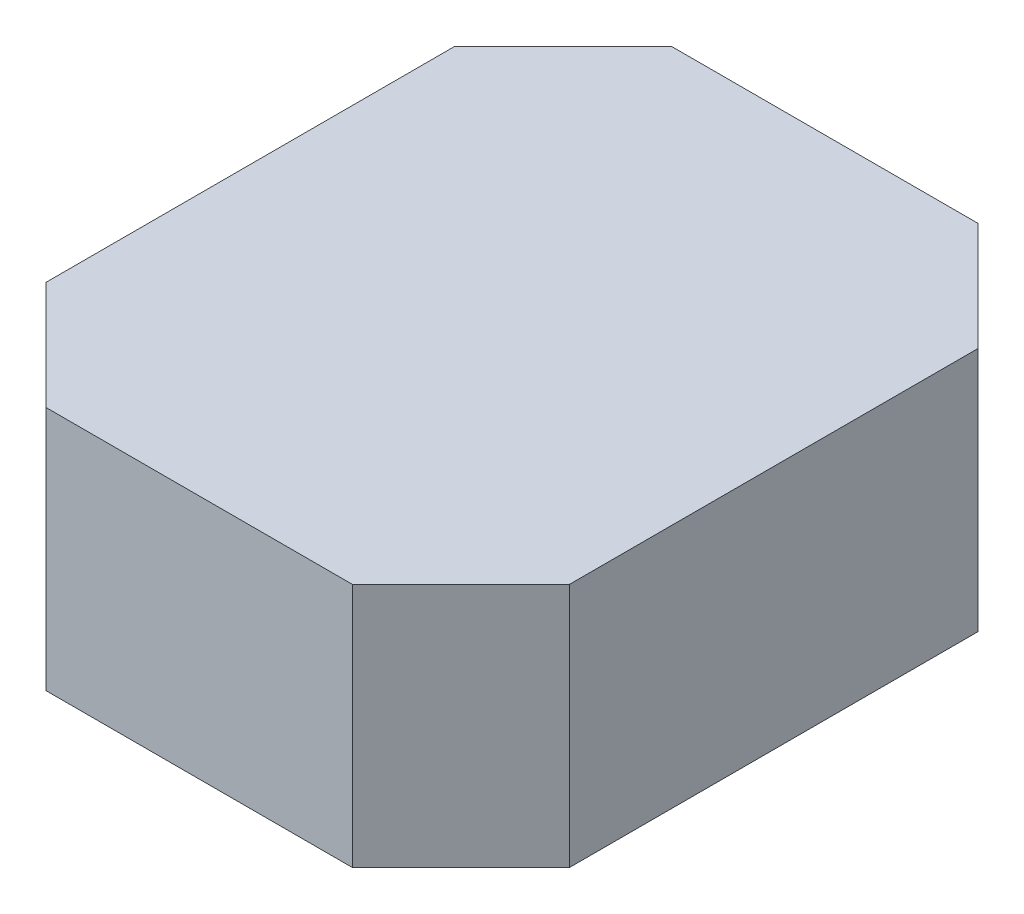
ISO-10303-21;
HEADER;
FILE_DESCRIPTION(('STEP AP214'),'2;1');
FILE_NAME('part.step','',(''),(''),'','','');
FILE_SCHEMA(('AUTOMOTIVE_DESIGN { 1 0 10303 214 1 1 1 1 }'));
ENDSEC;
DATA;
#1=APPLICATION_CONTEXT('core data for automotive mechanical design processes');
#2=APPLICATION_PROTOCOL_DEFINITION('international standard','automotive_design',2000,#1);
#3=PRODUCT_CONTEXT('',#1,'mechanical');
#4=PRODUCT('Part','Part','',(#3));
#5=PRODUCT_RELATED_PRODUCT_CATEGORY('part','',(#4));
#6=PRODUCT_DEFINITION_FORMATION('','',#4);
#7=PRODUCT_DEFINITION_CONTEXT('part definition',#1,'design');
#8=PRODUCT_DEFINITION('design','',#6,#7);
#9=PRODUCT_DEFINITION_SHAPE('','',#8);
#10=(LENGTH_UNIT() NAMED_UNIT(*) SI_UNIT(.MILLI.,.METRE.));
#11=(NAMED_UNIT(*) PLANE_ANGLE_UNIT() SI_UNIT($,.RADIAN.));
#12=(NAMED_UNIT(*) SI_UNIT($,.STERADIAN.) SOLID_ANGLE_UNIT());
#13=UNCERTAINTY_MEASURE_WITH_UNIT(LENGTH_MEASURE(1.E-05),#10,'distance_accuracy_value','');
#14=(GEOMETRIC_REPRESENTATION_CONTEXT(3) GLOBAL_UNCERTAINTY_ASSIGNED_CONTEXT((#13)) GLOBAL_UNIT_ASSIGNED_CONTEXT((#10,
#11,#12)) REPRESENTATION_CONTEXT('',''));
#15=CARTESIAN_POINT('',(0.,0.,0.));
#16=DIRECTION('',(0.,0.,1.));
#17=DIRECTION('',(1.,0.,0.));
#18=AXIS2_PLACEMENT_3D('',#15,#16,#17);
#19=CARTESIAN_POINT('',(-128.033008588991,120.,100.));
#20=DIRECTION('',(0.707106781186547,0.,-0.707106781186548));
#21=DIRECTION('',(-0.707106781186548,0.,-0.707106781186547));
#22=AXIS2_PLACEMENT_3D('',#19,#20,#21);
#23=PLANE('',#22);
#24=DIRECTION('',(0.707106781186548,0.,0.707106781186547));
#25=VECTOR('',#24,1.);
#26=CARTESIAN_POINT('',(-128.033008588991,0.,100.));
#27=LINE('',#26,#25);
#28=CARTESIAN_POINT('',(-128.033008588991,0.,100.));
#29=VERTEX_POINT('',#28);
#30=CARTESIAN_POINT('',(-75.,0.,153.033008588991));
#31=VERTEX_POINT('',#30);
#32=EDGE_CURVE('E143',#29,#31,#27,.T.);
#33=ORIENTED_EDGE('',*,*,#32,.T.);
#34=DIRECTION('',(0.,-1.,0.));
#35=VECTOR('',#34,1.);
#36=CARTESIAN_POINT('',(-75.,120.,153.033008588991));
#37=LINE('',#36,#35);
#38=CARTESIAN_POINT('',(-75.,120.,153.033008588991));
#39=VERTEX_POINT('',#38);
#40=EDGE_CURVE('E11',#39,#31,#37,.T.);
#41=ORIENTED_EDGE('',*,*,#40,.F.);
#42=DIRECTION('',(0.707106781186548,0.,0.707106781186547));
#43=VECTOR('',#42,1.);
#44=CARTESIAN_POINT('',(-128.033008588991,120.,100.));
#45=LINE('',#44,#43);
#46=CARTESIAN_POINT('',(-128.033008588991,120.,100.));
#47=VERTEX_POINT('',#46);
#48=EDGE_CURVE('E165',#47,#39,#45,.T.);
#49=ORIENTED_EDGE('',*,*,#48,.F.);
#50=DIRECTION('',(0.,-1.,0.));
#51=VECTOR('',#50,1.);
#52=CARTESIAN_POINT('',(-128.033008588991,120.,100.));
#53=LINE('',#52,#51);
#54=EDGE_CURVE('E139',#47,#29,#53,.T.);
#55=ORIENTED_EDGE('',*,*,#54,.T.);
#56=EDGE_LOOP('',(#33,#41,#49,#55));
#57=FACE_BOUND('',#56,.T.);
#58=ADVANCED_FACE('F41',(#57),#23,.F.);
#59=CARTESIAN_POINT('',(-75.,120.,153.033008588991));
#60=DIRECTION('',(0.,0.,-1.));
#61=DIRECTION('',(-1.,0.,0.));
#62=AXIS2_PLACEMENT_3D('',#59,#60,#61);
#63=PLANE('',#62);
#64=DIRECTION('',(1.,0.,0.));
#65=VECTOR('',#64,1.);
#66=CARTESIAN_POINT('',(-75.,0.,153.033008588991));
#67=LINE('',#66,#65);
#68=CARTESIAN_POINT('',(75.0000000000002,0.,153.033008588991));
#69=VERTEX_POINT('',#68);
#70=EDGE_CURVE('E147',#31,#69,#67,.T.);
#71=ORIENTED_EDGE('',*,*,#70,.T.);
#72=DIRECTION('',(0.,-1.,0.));
#73=VECTOR('',#72,1.);
#74=CARTESIAN_POINT('',(75.0000000000002,120.,153.033008588991));
#75=LINE('',#74,#73);
#76=CARTESIAN_POINT('',(75.0000000000002,120.,153.033008588991));
#77=VERTEX_POINT('',#76);
#78=EDGE_CURVE('E50',#77,#69,#75,.T.);
#79=ORIENTED_EDGE('',*,*,#78,.F.);
#80=DIRECTION('',(1.,0.,0.));
#81=VECTOR('',#80,1.);
#82=CARTESIAN_POINT('',(-75.,120.,153.033008588991));
#83=LINE('',#82,#81);
#84=EDGE_CURVE('E101',#39,#77,#83,.T.);
#85=ORIENTED_EDGE('',*,*,#84,.F.);
#86=ORIENTED_EDGE('',*,*,#40,.T.);
#87=EDGE_LOOP('',(#71,#79,#85,#86));
#88=FACE_BOUND('',#87,.T.);
#89=ADVANCED_FACE('F214',(#88),#63,.F.);
#90=CARTESIAN_POINT('',(128.033008588991,120.,100.));
#91=DIRECTION('',(-0.707106781186547,0.,-0.707106781186548));
#92=DIRECTION('',(-0.707106781186548,0.,0.707106781186547));
#93=AXIS2_PLACEMENT_3D('',#90,#91,#92);
#94=PLANE('',#93);
#95=DIRECTION('',(0.707106781186548,0.,-0.707106781186547));
#96=VECTOR('',#95,1.);
#97=CARTESIAN_POINT('',(128.033008588991,0.,100.));
#98=LINE('',#97,#96);
#99=CARTESIAN_POINT('',(128.033008588991,0.,100.));
#100=VERTEX_POINT('',#99);
#101=EDGE_CURVE('E150',#69,#100,#98,.T.);
#102=ORIENTED_EDGE('',*,*,#101,.T.);
#103=DIRECTION('',(0.,-1.,0.));
#104=VECTOR('',#103,1.);
#105=CARTESIAN_POINT('',(128.033008588991,120.,100.));
#106=LINE('',#105,#104);
#107=CARTESIAN_POINT('',(128.033008588991,120.,100.));
#108=VERTEX_POINT('',#107);
#109=EDGE_CURVE('E176',#108,#100,#106,.T.);
#110=ORIENTED_EDGE('',*,*,#109,.F.);
#111=DIRECTION('',(0.707106781186548,0.,-0.707106781186547));
#112=VECTOR('',#111,1.);
#113=CARTESIAN_POINT('',(128.033008588991,120.,100.));
#114=LINE('',#113,#112);
#115=EDGE_CURVE('E187',#77,#108,#114,.T.);
#116=ORIENTED_EDGE('',*,*,#115,.F.);
#117=ORIENTED_EDGE('',*,*,#78,.T.);
#118=EDGE_LOOP('',(#102,#110,#116,#117));
#119=FACE_BOUND('',#118,.T.);
#120=ADVANCED_FACE('F185',(#119),#94,.F.);
#121=CARTESIAN_POINT('',(128.033008588991,120.,-99.9999999999998));
#122=DIRECTION('',(-1.,0.,0.));
#123=DIRECTION('',(0.,0.,1.));
#124=AXIS2_PLACEMENT_3D('',#121,#122,#123);
#125=PLANE('',#124);
#126=DIRECTION('',(0.,0.,-1.));
#127=VECTOR('',#126,1.);
#128=CARTESIAN_POINT('',(128.033008588991,0.,-99.9999999999998));
#129=LINE('',#128,#127);
#130=CARTESIAN_POINT('',(128.033008588991,0.,-99.9999999999998));
#131=VERTEX_POINT('',#130);
#132=EDGE_CURVE('E153',#100,#131,#129,.T.);
#133=ORIENTED_EDGE('',*,*,#132,.T.);
#134=DIRECTION('',(0.,-1.,0.));
#135=VECTOR('',#134,1.);
#136=CARTESIAN_POINT('',(128.033008588991,120.,-99.9999999999998));
#137=LINE('',#136,#135);
#138=CARTESIAN_POINT('',(128.033008588991,120.,-99.9999999999998));
#139=VERTEX_POINT('',#138);
#140=EDGE_CURVE('E172',#139,#131,#137,.T.);
#141=ORIENTED_EDGE('',*,*,#140,.F.);
#142=DIRECTION('',(0.,0.,-1.));
#143=VECTOR('',#142,1.);
#144=CARTESIAN_POINT('',(128.033008588991,120.,-99.9999999999998));
#145=LINE('',#144,#143);
#146=EDGE_CURVE('E200',#108,#139,#145,.T.);
#147=ORIENTED_EDGE('',*,*,#146,.F.);
#148=ORIENTED_EDGE('',*,*,#109,.T.);
#149=EDGE_LOOP('',(#133,#141,#147,#148));
#150=FACE_BOUND('',#149,.T.);
#151=ADVANCED_FACE('F195',(#150),#125,.F.);
#152=CARTESIAN_POINT('',(128.033008588991,120.,-99.9999999999998));
#153=DIRECTION('',(-0.707106781186547,0.,0.707106781186548));
#154=DIRECTION('',(0.707106781186548,0.,0.707106781186547));
#155=AXIS2_PLACEMENT_3D('',#152,#153,#154);
#156=PLANE('',#155);
#157=DIRECTION('',(-0.707106781186548,0.,-0.707106781186547));
#158=VECTOR('',#157,1.);
#159=CARTESIAN_POINT('',(128.033008588991,0.,-99.9999999999998));
#160=LINE('',#159,#158);
#161=CARTESIAN_POINT('',(75.0000000000001,0.,-153.033008588991));
#162=VERTEX_POINT('',#161);
#163=EDGE_CURVE('E156',#131,#162,#160,.T.);
#164=ORIENTED_EDGE('',*,*,#163,.T.);
#165=DIRECTION('',(0.,-1.,0.));
#166=VECTOR('',#165,1.);
#167=CARTESIAN_POINT('',(75.0000000000001,120.,-153.033008588991));
#168=LINE('',#167,#166);
#169=CARTESIAN_POINT('',(75.0000000000001,120.,-153.033008588991));
#170=VERTEX_POINT('',#169);
#171=EDGE_CURVE('E131',#170,#162,#168,.T.);
#172=ORIENTED_EDGE('',*,*,#171,.F.);
#173=DIRECTION('',(-0.707106781186548,0.,-0.707106781186547));
#174=VECTOR('',#173,1.);
#175=CARTESIAN_POINT('',(128.033008588991,120.,-99.9999999999998));
#176=LINE('',#175,#174);
#177=EDGE_CURVE('E120',#139,#170,#176,.T.);
#178=ORIENTED_EDGE('',*,*,#177,.F.);
#179=ORIENTED_EDGE('',*,*,#140,.T.);
#180=EDGE_LOOP('',(#164,#172,#178,#179));
#181=FACE_BOUND('',#180,.T.);
#182=ADVANCED_FACE('F198',(#181),#156,.F.);
#183=CARTESIAN_POINT('',(-75.,120.,-153.033008588991));
#184=DIRECTION('',(0.,0.,1.));
#185=DIRECTION('',(1.,0.,0.));
#186=AXIS2_PLACEMENT_3D('',#183,#184,#185);
#187=PLANE('',#186);
#188=DIRECTION('',(-1.,0.,0.));
#189=VECTOR('',#188,1.);
#190=CARTESIAN_POINT('',(-75.,0.,-153.033008588991));
#191=LINE('',#190,#189);
#192=CARTESIAN_POINT('',(-75.,0.,-153.033008588991));
#193=VERTEX_POINT('',#192);
#194=EDGE_CURVE('E129',#162,#193,#191,.T.);
#195=ORIENTED_EDGE('',*,*,#194,.T.);
#196=DIRECTION('',(0.,-1.,0.));
#197=VECTOR('',#196,1.);
#198=CARTESIAN_POINT('',(-75.,120.,-153.033008588991));
#199=LINE('',#198,#197);
#200=CARTESIAN_POINT('',(-75.,120.,-153.033008588991));
#201=VERTEX_POINT('',#200);
#202=EDGE_CURVE('E126',#201,#193,#199,.T.);
#203=ORIENTED_EDGE('',*,*,#202,.F.);
#204=DIRECTION('',(-1.,0.,0.));
#205=VECTOR('',#204,1.);
#206=CARTESIAN_POINT('',(-75.,120.,-153.033008588991));
#207=LINE('',#206,#205);
#208=EDGE_CURVE('E114',#170,#201,#207,.T.);
#209=ORIENTED_EDGE('',*,*,#208,.F.);
#210=ORIENTED_EDGE('',*,*,#171,.T.);
#211=EDGE_LOOP('',(#195,#203,#209,#210));
#212=FACE_BOUND('',#211,.T.);
#213=ADVANCED_FACE('F127',(#212),#187,.F.);
#214=CARTESIAN_POINT('',(-128.033008588991,120.,-99.9999999999998));
#215=DIRECTION('',(0.707106781186547,0.,0.707106781186548));
#216=DIRECTION('',(0.707106781186548,0.,-0.707106781186547));
#217=AXIS2_PLACEMENT_3D('',#214,#215,#216);
#218=PLANE('',#217);
#219=DIRECTION('',(-0.707106781186548,0.,0.707106781186547));
#220=VECTOR('',#219,1.);
#221=CARTESIAN_POINT('',(-128.033008588991,0.,-99.9999999999998));
#222=LINE('',#221,#220);
#223=CARTESIAN_POINT('',(-128.033008588991,0.,-99.9999999999998));
#224=VERTEX_POINT('',#223);
#225=EDGE_CURVE('E87',#193,#224,#222,.T.);
#226=ORIENTED_EDGE('',*,*,#225,.T.);
#227=DIRECTION('',(0.,-1.,0.));
#228=VECTOR('',#227,1.);
#229=CARTESIAN_POINT('',(-128.033008588991,120.,-99.9999999999998));
#230=LINE('',#229,#228);
#231=CARTESIAN_POINT('',(-128.033008588991,120.,-99.9999999999998));
#232=VERTEX_POINT('',#231);
#233=EDGE_CURVE('E132',#232,#224,#230,.T.);
#234=ORIENTED_EDGE('',*,*,#233,.F.);
#235=DIRECTION('',(-0.707106781186548,0.,0.707106781186547));
#236=VECTOR('',#235,1.);
#237=CARTESIAN_POINT('',(-128.033008588991,120.,-99.9999999999998));
#238=LINE('',#237,#236);
#239=EDGE_CURVE('E118',#201,#232,#238,.T.);
#240=ORIENTED_EDGE('',*,*,#239,.F.);
#241=ORIENTED_EDGE('',*,*,#202,.T.);
#242=EDGE_LOOP('',(#226,#234,#240,#241));
#243=FACE_BOUND('',#242,.T.);
#244=ADVANCED_FACE('F134',(#243),#218,.F.);
#245=CARTESIAN_POINT('',(-128.033008588991,120.,-99.9999999999998));
#246=DIRECTION('',(1.,0.,0.));
#247=DIRECTION('',(0.,0.,-1.));
#248=AXIS2_PLACEMENT_3D('',#245,#246,#247);
#249=PLANE('',#248);
#250=DIRECTION('',(0.,0.,1.));
#251=VECTOR('',#250,1.);
#252=CARTESIAN_POINT('',(-128.033008588991,0.,-99.9999999999998));
#253=LINE('',#252,#251);
#254=EDGE_CURVE('E93',#224,#29,#253,.T.);
#255=ORIENTED_EDGE('',*,*,#254,.T.);
#256=ORIENTED_EDGE('',*,*,#54,.F.);
#257=DIRECTION('',(0.,0.,1.));
#258=VECTOR('',#257,1.);
#259=CARTESIAN_POINT('',(-128.033008588991,120.,-99.9999999999998));
#260=LINE('',#259,#258);
#261=EDGE_CURVE('E58',#232,#47,#260,.T.);
#262=ORIENTED_EDGE('',*,*,#261,.F.);
#263=ORIENTED_EDGE('',*,*,#233,.T.);
#264=EDGE_LOOP('',(#255,#256,#262,#263));
#265=FACE_BOUND('',#264,.T.);
#266=ADVANCED_FACE('F230',(#265),#249,.F.);
#267=CARTESIAN_POINT('',(0.,120.,0.));
#268=DIRECTION('',(0.,-1.,0.));
#269=DIRECTION('',(0.,0.,-1.));
#270=AXIS2_PLACEMENT_3D('',#267,#268,#269);
#271=PLANE('',#270);
#272=ORIENTED_EDGE('',*,*,#48,.T.);
#273=ORIENTED_EDGE('',*,*,#84,.T.);
#274=ORIENTED_EDGE('',*,*,#115,.T.);
#275=ORIENTED_EDGE('',*,*,#146,.T.);
#276=ORIENTED_EDGE('',*,*,#177,.T.);
#277=ORIENTED_EDGE('',*,*,#208,.T.);
#278=ORIENTED_EDGE('',*,*,#239,.T.);
#279=ORIENTED_EDGE('',*,*,#261,.T.);
#280=EDGE_LOOP('',(#272,#273,#274,#275,#276,#277,#278,#279));
#281=FACE_BOUND('',#280,.T.);
#282=ADVANCED_FACE('F116',(#281),#271,.F.);
#283=CARTESIAN_POINT('',(0.,0.,0.));
#284=DIRECTION('',(0.,-1.,0.));
#285=DIRECTION('',(0.,0.,-1.));
#286=AXIS2_PLACEMENT_3D('',#283,#284,#285);
#287=PLANE('',#286);
#288=ORIENTED_EDGE('',*,*,#32,.F.);
#289=ORIENTED_EDGE('',*,*,#254,.F.);
#290=ORIENTED_EDGE('',*,*,#225,.F.);
#291=ORIENTED_EDGE('',*,*,#194,.F.);
#292=ORIENTED_EDGE('',*,*,#163,.F.);
#293=ORIENTED_EDGE('',*,*,#132,.F.);
#294=ORIENTED_EDGE('',*,*,#101,.F.);
#295=ORIENTED_EDGE('',*,*,#70,.F.);
#296=EDGE_LOOP('',(#288,#289,#290,#291,#292,#293,#294,#295));
#297=FACE_BOUND('',#296,.T.);
#298=ADVANCED_FACE('F191',(#297),#287,.T.);
#299=CLOSED_SHELL('',(#58,#89,#120,#151,#182,#213,#244,#266,#282,#298));
#300=MANIFOLD_SOLID_BREP('B2',#299);
#301=ADVANCED_BREP_SHAPE_REPRESENTATION('',(#18,#300),#14);
#302=SHAPE_DEFINITION_REPRESENTATION(#9,#301);
ENDSEC;
END-ISO-10303-21;
